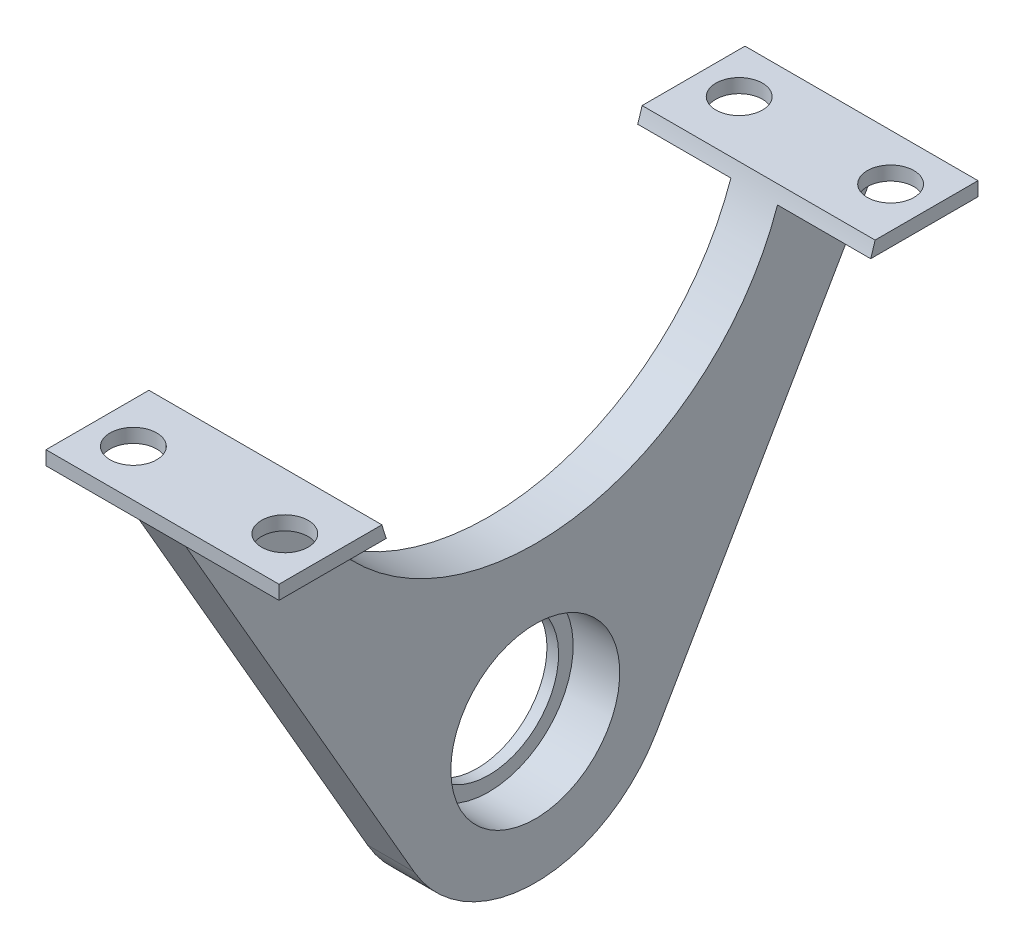
ISO-10303-21;
HEADER;
FILE_DESCRIPTION(('STEP AP214'),'2;1');
FILE_NAME('part.step','',(''),(''),'','','');
FILE_SCHEMA(('AUTOMOTIVE_DESIGN { 1 0 10303 214 1 1 1 1 }'));
ENDSEC;
DATA;
#1=APPLICATION_CONTEXT('core data for automotive mechanical design processes');
#2=APPLICATION_PROTOCOL_DEFINITION('international standard','automotive_design',2000,#1);
#3=PRODUCT_CONTEXT('',#1,'mechanical');
#4=PRODUCT('Part','Part','',(#3));
#5=PRODUCT_RELATED_PRODUCT_CATEGORY('part','',(#4));
#6=PRODUCT_DEFINITION_FORMATION('','',#4);
#7=PRODUCT_DEFINITION_CONTEXT('part definition',#1,'design');
#8=PRODUCT_DEFINITION('design','',#6,#7);
#9=PRODUCT_DEFINITION_SHAPE('','',#8);
#10=(LENGTH_UNIT() NAMED_UNIT(*) SI_UNIT(.MILLI.,.METRE.));
#11=(NAMED_UNIT(*) PLANE_ANGLE_UNIT() SI_UNIT($,.RADIAN.));
#12=(NAMED_UNIT(*) SI_UNIT($,.STERADIAN.) SOLID_ANGLE_UNIT());
#13=UNCERTAINTY_MEASURE_WITH_UNIT(LENGTH_MEASURE(1.E-05),#10,'distance_accuracy_value','');
#14=(GEOMETRIC_REPRESENTATION_CONTEXT(3) GLOBAL_UNCERTAINTY_ASSIGNED_CONTEXT((#13)) GLOBAL_UNIT_ASSIGNED_CONTEXT((#10,
#11,#12)) REPRESENTATION_CONTEXT('',''));
#15=CARTESIAN_POINT('',(0.,0.,0.));
#16=DIRECTION('',(0.,0.,1.));
#17=DIRECTION('',(1.,0.,0.));
#18=AXIS2_PLACEMENT_3D('',#15,#16,#17);
#19=CARTESIAN_POINT('',(0.,0.,60.));
#20=DIRECTION('',(-1.,0.,0.));
#21=DIRECTION('',(0.,0.,1.));
#22=AXIS2_PLACEMENT_3D('',#19,#20,#21);
#23=PLANE('',#22);
#24=CARTESIAN_POINT('',(0.,12.,30.));
#25=DIRECTION('',(-1.,0.,0.));
#26=DIRECTION('',(0.,0.,1.));
#27=AXIS2_PLACEMENT_3D('',#24,#25,#26);
#28=CIRCLE('',#27,7.25);
#29=CARTESIAN_POINT('',(0.,12.,37.25));
#30=VERTEX_POINT('',#29);
#31=EDGE_CURVE('E377',#30,#30,#28,.F.);
#32=ORIENTED_EDGE('',*,*,#31,.F.);
#33=EDGE_LOOP('',(#32));
#34=FACE_BOUND('',#33,.T.);
#35=DIRECTION('',(0.,0.866270394738433,0.499575422934035));
#36=VECTOR('',#35,1.);
#37=CARTESIAN_POINT('',(0.,9.98302412798879,42.6893040469326));
#38=LINE('',#37,#36);
#39=CARTESIAN_POINT('',(0.,6.00509492479158,40.3952447368612));
#40=VERTEX_POINT('',#39);
#41=CARTESIAN_POINT('',(0.,40.,60.));
#42=VERTEX_POINT('',#41);
#43=EDGE_CURVE('E282',#40,#42,#38,.T.);
#44=ORIENTED_EDGE('',*,*,#43,.F.);
#45=CARTESIAN_POINT('',(0.,12.,30.));
#46=DIRECTION('',(-1.,0.,0.));
#47=DIRECTION('',(0.,0.,1.));
#48=AXIS2_PLACEMENT_3D('',#45,#46,#47);
#49=CIRCLE('',#48,12.);
#50=CARTESIAN_POINT('',(0.,6.00509492479158,19.6047552631388));
#51=VERTEX_POINT('',#50);
#52=EDGE_CURVE('E374',#40,#51,#49,.F.);
#53=ORIENTED_EDGE('',*,*,#52,.T.);
#54=DIRECTION('',(0.,-0.866270394738433,0.499575422934035));
#55=VECTOR('',#54,1.);
#56=CARTESIAN_POINT('',(0.,-15.9830198016124,32.2852321450506));
#57=LINE('',#56,#55);
#58=CARTESIAN_POINT('',(0.,40.,0.));
#59=VERTEX_POINT('',#58);
#60=EDGE_CURVE('E380',#59,#51,#57,.T.);
#61=ORIENTED_EDGE('',*,*,#60,.F.);
#62=DIRECTION('',(0.,0.,-1.));
#63=VECTOR('',#62,1.);
#64=CARTESIAN_POINT('',(0.,40.,60.));
#65=LINE('',#64,#63);
#66=CARTESIAN_POINT('',(0.,40.,9.21154166370193));
#67=VERTEX_POINT('',#66);
#68=EDGE_CURVE('E323',#67,#59,#65,.T.);
#69=ORIENTED_EDGE('',*,*,#68,.F.);
#70=CARTESIAN_POINT('',(0.,47.2,30.));
#71=DIRECTION('',(-1.,0.,0.));
#72=DIRECTION('',(0.,0.,1.));
#73=AXIS2_PLACEMENT_3D('',#70,#71,#72);
#74=CIRCLE('',#73,22.);
#75=CARTESIAN_POINT('',(0.,40.,50.7884583362981));
#76=VERTEX_POINT('',#75);
#77=EDGE_CURVE('E363',#76,#67,#74,.F.);
#78=ORIENTED_EDGE('',*,*,#77,.F.);
#79=EDGE_CURVE('E324',#42,#76,#65,.T.);
#80=ORIENTED_EDGE('',*,*,#79,.F.);
#81=EDGE_LOOP('',(#44,#53,#61,#69,#78,#80));
#82=FACE_BOUND('',#81,.T.);
#83=ADVANCED_FACE('F167',(#34,#82),#23,.F.);
#84=CARTESIAN_POINT('',(-4.,40.,60.));
#85=DIRECTION('',(1.,0.,0.));
#86=DIRECTION('',(0.,1.,0.));
#87=AXIS2_PLACEMENT_3D('',#84,#85,#86);
#88=PLANE('',#87);
#89=CARTESIAN_POINT('',(-4.,12.,30.));
#90=DIRECTION('',(1.,0.,0.));
#91=DIRECTION('',(0.,1.,0.));
#92=AXIS2_PLACEMENT_3D('',#89,#90,#91);
#93=CIRCLE('',#92,7.99999999999999);
#94=CARTESIAN_POINT('',(-4.,20.,30.));
#95=VERTEX_POINT('',#94);
#96=EDGE_CURVE('E12',#95,#95,#93,.F.);
#97=ORIENTED_EDGE('',*,*,#96,.F.);
#98=EDGE_LOOP('',(#97));
#99=FACE_BOUND('',#98,.T.);
#100=CARTESIAN_POINT('',(-4.,12.,30.));
#101=DIRECTION('',(1.,0.,0.));
#102=DIRECTION('',(0.,1.,0.));
#103=AXIS2_PLACEMENT_3D('',#100,#101,#102);
#104=CIRCLE('',#103,12.);
#105=CARTESIAN_POINT('',(-4.,6.00509492479158,19.6047552631388));
#106=VERTEX_POINT('',#105);
#107=CARTESIAN_POINT('',(-4.,6.00509492479158,40.3952447368612));
#108=VERTEX_POINT('',#107);
#109=EDGE_CURVE('E290',#106,#108,#104,.F.);
#110=ORIENTED_EDGE('',*,*,#109,.T.);
#111=DIRECTION('',(0.,-0.866270394738433,-0.499575422934035));
#112=VECTOR('',#111,1.);
#113=CARTESIAN_POINT('',(-4.,40.,60.));
#114=LINE('',#113,#112);
#115=CARTESIAN_POINT('',(-4.,40.,60.));
#116=VERTEX_POINT('',#115);
#117=EDGE_CURVE('E279',#116,#108,#114,.T.);
#118=ORIENTED_EDGE('',*,*,#117,.F.);
#119=DIRECTION('',(0.,0.,-1.));
#120=VECTOR('',#119,1.);
#121=CARTESIAN_POINT('',(-4.,40.,60.));
#122=LINE('',#121,#120);
#123=CARTESIAN_POINT('',(-4.,40.,50.7884583362981));
#124=VERTEX_POINT('',#123);
#125=EDGE_CURVE('E289',#116,#124,#122,.T.);
#126=ORIENTED_EDGE('',*,*,#125,.T.);
#127=CARTESIAN_POINT('',(-4.,47.2,30.));
#128=DIRECTION('',(1.,0.,0.));
#129=DIRECTION('',(0.,1.,0.));
#130=AXIS2_PLACEMENT_3D('',#127,#128,#129);
#131=CIRCLE('',#130,22.);
#132=CARTESIAN_POINT('',(-4.,40.,9.21154166370194));
#133=VERTEX_POINT('',#132);
#134=EDGE_CURVE('E284',#133,#124,#131,.F.);
#135=ORIENTED_EDGE('',*,*,#134,.F.);
#136=CARTESIAN_POINT('',(-4.,40.,0.));
#137=VERTEX_POINT('',#136);
#138=EDGE_CURVE('E298',#133,#137,#122,.T.);
#139=ORIENTED_EDGE('',*,*,#138,.T.);
#140=DIRECTION('',(0.,0.866270394738433,-0.499575422934035));
#141=VECTOR('',#140,1.);
#142=CARTESIAN_POINT('',(-4.,14.0339560703988,14.9745361919832));
#143=LINE('',#142,#141);
#144=EDGE_CURVE('E215',#106,#137,#143,.T.);
#145=ORIENTED_EDGE('',*,*,#144,.F.);
#146=EDGE_LOOP('',(#110,#118,#126,#135,#139,#145));
#147=FACE_BOUND('',#146,.T.);
#148=ADVANCED_FACE('F287',(#99,#147),#88,.F.);
#149=CARTESIAN_POINT('',(0.,0.,60.));
#150=DIRECTION('',(0.,0.,1.));
#151=DIRECTION('',(1.,0.,0.));
#152=AXIS2_PLACEMENT_3D('',#149,#150,#151);
#153=PLANE('',#152);
#154=DIRECTION('',(1.,0.,0.));
#155=VECTOR('',#154,1.);
#156=CARTESIAN_POINT('',(-12.,40.,60.));
#157=LINE('',#156,#155);
#158=CARTESIAN_POINT('',(-12.,40.,60.));
#159=VERTEX_POINT('',#158);
#160=EDGE_CURVE('E294',#159,#116,#157,.T.);
#161=ORIENTED_EDGE('',*,*,#160,.T.);
#162=DIRECTION('',(1.,0.,0.));
#163=VECTOR('',#162,1.);
#164=CARTESIAN_POINT('',(0.,40.,60.));
#165=LINE('',#164,#163);
#166=EDGE_CURVE('E174',#116,#42,#165,.T.);
#167=ORIENTED_EDGE('',*,*,#166,.T.);
#168=DIRECTION('',(1.,0.,0.));
#169=VECTOR('',#168,1.);
#170=CARTESIAN_POINT('',(0.,40.,60.));
#171=LINE('',#170,#169);
#172=CARTESIAN_POINT('',(8.,40.,60.));
#173=VERTEX_POINT('',#172);
#174=EDGE_CURVE('E222',#42,#173,#171,.T.);
#175=ORIENTED_EDGE('',*,*,#174,.T.);
#176=DIRECTION('',(0.,1.,0.));
#177=VECTOR('',#176,1.);
#178=CARTESIAN_POINT('',(8.,40.,60.));
#179=LINE('',#178,#177);
#180=CARTESIAN_POINT('',(8.,41.2,60.));
#181=VERTEX_POINT('',#180);
#182=EDGE_CURVE('E343',#173,#181,#179,.T.);
#183=ORIENTED_EDGE('',*,*,#182,.T.);
#184=DIRECTION('',(-1.,0.,0.));
#185=VECTOR('',#184,1.);
#186=CARTESIAN_POINT('',(8.,41.2,60.));
#187=LINE('',#186,#185);
#188=CARTESIAN_POINT('',(-12.,41.2,60.));
#189=VERTEX_POINT('',#188);
#190=EDGE_CURVE('E358',#181,#189,#187,.T.);
#191=ORIENTED_EDGE('',*,*,#190,.T.);
#192=DIRECTION('',(0.,-1.,0.));
#193=VECTOR('',#192,1.);
#194=CARTESIAN_POINT('',(-12.,41.2,60.));
#195=LINE('',#194,#193);
#196=EDGE_CURVE('E190',#189,#159,#195,.T.);
#197=ORIENTED_EDGE('',*,*,#196,.T.);
#198=EDGE_LOOP('',(#161,#167,#175,#183,#191,#197));
#199=FACE_BOUND('',#198,.T.);
#200=ADVANCED_FACE('F295',(#199),#153,.T.);
#201=CARTESIAN_POINT('',(0.,40.,60.));
#202=DIRECTION('',(0.,1.,0.));
#203=DIRECTION('',(-1.,0.,0.));
#204=AXIS2_PLACEMENT_3D('',#201,#202,#203);
#205=PLANE('',#204);
#206=CARTESIAN_POINT('',(4.5,40.,4.));
#207=DIRECTION('',(0.,-1.,0.));
#208=DIRECTION('',(-1.,0.,0.));
#209=AXIS2_PLACEMENT_3D('',#206,#207,#208);
#210=CIRCLE('',#209,2.);
#211=CARTESIAN_POINT('',(6.5,40.,4.));
#212=VERTEX_POINT('',#211);
#213=EDGE_CURVE('E414',#212,#212,#210,.T.);
#214=ORIENTED_EDGE('',*,*,#213,.F.);
#215=EDGE_LOOP('',(#214));
#216=FACE_BOUND('',#215,.T.);
#217=DIRECTION('',(-1.,0.,0.));
#218=VECTOR('',#217,1.);
#219=CARTESIAN_POINT('',(40.,40.,9.21154166370193));
#220=LINE('',#219,#218);
#221=CARTESIAN_POINT('',(8.,40.,9.21154166370194));
#222=VERTEX_POINT('',#221);
#223=EDGE_CURVE('E365',#67,#222,#220,.F.);
#224=ORIENTED_EDGE('',*,*,#223,.F.);
#225=ORIENTED_EDGE('',*,*,#68,.T.);
#226=DIRECTION('',(1.,0.,0.));
#227=VECTOR('',#226,1.);
#228=CARTESIAN_POINT('',(0.,40.,0.));
#229=LINE('',#228,#227);
#230=CARTESIAN_POINT('',(8.,40.,0.));
#231=VERTEX_POINT('',#230);
#232=EDGE_CURVE('E353',#59,#231,#229,.T.);
#233=ORIENTED_EDGE('',*,*,#232,.T.);
#234=DIRECTION('',(0.,0.,-1.));
#235=VECTOR('',#234,1.);
#236=CARTESIAN_POINT('',(8.,40.,60.));
#237=LINE('',#236,#235);
#238=EDGE_CURVE('E319',#222,#231,#237,.T.);
#239=ORIENTED_EDGE('',*,*,#238,.F.);
#240=EDGE_LOOP('',(#224,#225,#233,#239));
#241=FACE_BOUND('',#240,.T.);
#242=ADVANCED_FACE('F436',(#216,#241),#205,.F.);
#243=CARTESIAN_POINT('',(4.5,40.,56.));
#244=DIRECTION('',(0.,-1.,0.));
#245=DIRECTION('',(1.,0.,0.));
#246=AXIS2_PLACEMENT_3D('',#243,#244,#245);
#247=CIRCLE('',#246,2.);
#248=CARTESIAN_POINT('',(6.5,40.,56.));
#249=VERTEX_POINT('',#248);
#250=EDGE_CURVE('E425',#249,#249,#247,.T.);
#251=ORIENTED_EDGE('',*,*,#250,.F.);
#252=EDGE_LOOP('',(#251));
#253=FACE_BOUND('',#252,.T.);
#254=DIRECTION('',(-1.,0.,0.));
#255=VECTOR('',#254,1.);
#256=CARTESIAN_POINT('',(40.,40.,50.7884583362981));
#257=LINE('',#256,#255);
#258=CARTESIAN_POINT('',(8.,40.,50.7884583362981));
#259=VERTEX_POINT('',#258);
#260=EDGE_CURVE('E361',#259,#76,#257,.T.);
#261=ORIENTED_EDGE('',*,*,#260,.F.);
#262=EDGE_CURVE('E320',#173,#259,#237,.T.);
#263=ORIENTED_EDGE('',*,*,#262,.F.);
#264=ORIENTED_EDGE('',*,*,#174,.F.);
#265=ORIENTED_EDGE('',*,*,#79,.T.);
#266=EDGE_LOOP('',(#261,#263,#264,#265));
#267=FACE_BOUND('',#266,.T.);
#268=ADVANCED_FACE('F432',(#253,#267),#205,.F.);
#269=CARTESIAN_POINT('',(8.,40.,60.));
#270=DIRECTION('',(-1.,0.,0.));
#271=DIRECTION('',(0.,0.,1.));
#272=AXIS2_PLACEMENT_3D('',#269,#270,#271);
#273=PLANE('',#272);
#274=CARTESIAN_POINT('',(8.,47.2,30.));
#275=DIRECTION('',(-1.,0.,0.));
#276=DIRECTION('',(0.,0.,1.));
#277=AXIS2_PLACEMENT_3D('',#274,#275,#276);
#278=CIRCLE('',#277,22.);
#279=CARTESIAN_POINT('',(8.,41.2,51.1660104885167));
#280=VERTEX_POINT('',#279);
#281=EDGE_CURVE('E355',#280,#259,#278,.F.);
#282=ORIENTED_EDGE('',*,*,#281,.F.);
#283=DIRECTION('',(0.,0.,-1.));
#284=VECTOR('',#283,1.);
#285=CARTESIAN_POINT('',(8.,41.2,60.));
#286=LINE('',#285,#284);
#287=EDGE_CURVE('E316',#181,#280,#286,.T.);
#288=ORIENTED_EDGE('',*,*,#287,.F.);
#289=ORIENTED_EDGE('',*,*,#182,.F.);
#290=ORIENTED_EDGE('',*,*,#262,.T.);
#291=EDGE_LOOP('',(#282,#288,#289,#290));
#292=FACE_BOUND('',#291,.T.);
#293=ADVANCED_FACE('F435',(#292),#273,.F.);
#294=CARTESIAN_POINT('',(8.,41.2,60.));
#295=DIRECTION('',(0.,-1.,0.));
#296=DIRECTION('',(0.,0.,-1.));
#297=AXIS2_PLACEMENT_3D('',#294,#295,#296);
#298=PLANE('',#297);
#299=CARTESIAN_POINT('',(-8.50000000000001,41.2,56.));
#300=DIRECTION('',(0.,-1.,0.));
#301=DIRECTION('',(0.,0.,-1.));
#302=AXIS2_PLACEMENT_3D('',#299,#300,#301);
#303=CIRCLE('',#302,2.);
#304=CARTESIAN_POINT('',(-6.5,41.2,56.));
#305=VERTEX_POINT('',#304);
#306=EDGE_CURVE('E411',#305,#305,#303,.F.);
#307=ORIENTED_EDGE('',*,*,#306,.F.);
#308=EDGE_LOOP('',(#307));
#309=FACE_BOUND('',#308,.T.);
#310=CARTESIAN_POINT('',(4.5,41.2,56.));
#311=DIRECTION('',(0.,-1.,0.));
#312=DIRECTION('',(0.,0.,-1.));
#313=AXIS2_PLACEMENT_3D('',#310,#311,#312);
#314=CIRCLE('',#313,2.);
#315=CARTESIAN_POINT('',(6.5,41.2,56.));
#316=VERTEX_POINT('',#315);
#317=EDGE_CURVE('E418',#316,#316,#314,.F.);
#318=ORIENTED_EDGE('',*,*,#317,.F.);
#319=EDGE_LOOP('',(#318));
#320=FACE_BOUND('',#319,.T.);
#321=DIRECTION('',(-1.,0.,0.));
#322=VECTOR('',#321,1.);
#323=CARTESIAN_POINT('',(40.,41.2,51.1660104885167));
#324=LINE('',#323,#322);
#325=CARTESIAN_POINT('',(-12.,41.2,51.1660104885167));
#326=VERTEX_POINT('',#325);
#327=EDGE_CURVE('E384',#280,#326,#324,.T.);
#328=ORIENTED_EDGE('',*,*,#327,.T.);
#329=DIRECTION('',(0.,0.,-1.));
#330=VECTOR('',#329,1.);
#331=CARTESIAN_POINT('',(-12.,41.2,60.));
#332=LINE('',#331,#330);
#333=EDGE_CURVE('E312',#189,#326,#332,.T.);
#334=ORIENTED_EDGE('',*,*,#333,.F.);
#335=ORIENTED_EDGE('',*,*,#190,.F.);
#336=ORIENTED_EDGE('',*,*,#287,.T.);
#337=EDGE_LOOP('',(#328,#334,#335,#336));
#338=FACE_BOUND('',#337,.T.);
#339=ADVANCED_FACE('F446',(#309,#320,#338),#298,.F.);
#340=CARTESIAN_POINT('',(4.5,41.2,4.));
#341=DIRECTION('',(0.,-1.,0.));
#342=DIRECTION('',(0.,0.,-1.));
#343=AXIS2_PLACEMENT_3D('',#340,#341,#342);
#344=CIRCLE('',#343,2.);
#345=CARTESIAN_POINT('',(6.5,41.2,4.));
#346=VERTEX_POINT('',#345);
#347=EDGE_CURVE('E410',#346,#346,#344,.F.);
#348=ORIENTED_EDGE('',*,*,#347,.F.);
#349=EDGE_LOOP('',(#348));
#350=FACE_BOUND('',#349,.T.);
#351=CARTESIAN_POINT('',(-8.50000000000001,41.2,4.));
#352=DIRECTION('',(0.,-1.,0.));
#353=DIRECTION('',(0.,0.,-1.));
#354=AXIS2_PLACEMENT_3D('',#351,#352,#353);
#355=CIRCLE('',#354,2.);
#356=CARTESIAN_POINT('',(-6.50000000000001,41.2,4.));
#357=VERTEX_POINT('',#356);
#358=EDGE_CURVE('E402',#357,#357,#355,.F.);
#359=ORIENTED_EDGE('',*,*,#358,.F.);
#360=EDGE_LOOP('',(#359));
#361=FACE_BOUND('',#360,.T.);
#362=DIRECTION('',(-1.,0.,0.));
#363=VECTOR('',#362,1.);
#364=CARTESIAN_POINT('',(40.,41.2,8.83398951148327));
#365=LINE('',#364,#363);
#366=CARTESIAN_POINT('',(8.,41.2,8.83398951148327));
#367=VERTEX_POINT('',#366);
#368=CARTESIAN_POINT('',(-12.,41.2,8.83398951148327));
#369=VERTEX_POINT('',#368);
#370=EDGE_CURVE('E383',#367,#369,#365,.T.);
#371=ORIENTED_EDGE('',*,*,#370,.F.);
#372=CARTESIAN_POINT('',(8.,41.2,0.));
#373=VERTEX_POINT('',#372);
#374=EDGE_CURVE('E315',#367,#373,#286,.T.);
#375=ORIENTED_EDGE('',*,*,#374,.T.);
#376=DIRECTION('',(-1.,0.,0.));
#377=VECTOR('',#376,1.);
#378=CARTESIAN_POINT('',(8.,41.2,0.));
#379=LINE('',#378,#377);
#380=CARTESIAN_POINT('',(-12.,41.2,0.));
#381=VERTEX_POINT('',#380);
#382=EDGE_CURVE('E345',#373,#381,#379,.T.);
#383=ORIENTED_EDGE('',*,*,#382,.T.);
#384=EDGE_CURVE('E311',#369,#381,#332,.T.);
#385=ORIENTED_EDGE('',*,*,#384,.F.);
#386=EDGE_LOOP('',(#371,#375,#383,#385));
#387=FACE_BOUND('',#386,.T.);
#388=ADVANCED_FACE('F467',(#350,#361,#387),#298,.F.);
#389=CARTESIAN_POINT('',(-12.,41.2,60.));
#390=DIRECTION('',(1.,0.,0.));
#391=DIRECTION('',(0.,0.,-1.));
#392=AXIS2_PLACEMENT_3D('',#389,#390,#391);
#393=PLANE('',#392);
#394=CARTESIAN_POINT('',(-12.,47.2,30.));
#395=DIRECTION('',(1.,0.,0.));
#396=DIRECTION('',(0.,0.,-1.));
#397=AXIS2_PLACEMENT_3D('',#394,#395,#396);
#398=CIRCLE('',#397,22.);
#399=CARTESIAN_POINT('',(-12.,40.,9.21154166370196));
#400=VERTEX_POINT('',#399);
#401=EDGE_CURVE('E369',#369,#400,#398,.F.);
#402=ORIENTED_EDGE('',*,*,#401,.F.);
#403=ORIENTED_EDGE('',*,*,#384,.T.);
#404=DIRECTION('',(0.,-1.,0.));
#405=VECTOR('',#404,1.);
#406=CARTESIAN_POINT('',(-12.,41.2,0.));
#407=LINE('',#406,#405);
#408=CARTESIAN_POINT('',(-12.,40.,0.));
#409=VERTEX_POINT('',#408);
#410=EDGE_CURVE('E342',#381,#409,#407,.T.);
#411=ORIENTED_EDGE('',*,*,#410,.T.);
#412=DIRECTION('',(0.,0.,-1.));
#413=VECTOR('',#412,1.);
#414=CARTESIAN_POINT('',(-12.,40.,60.));
#415=LINE('',#414,#413);
#416=EDGE_CURVE('E303',#400,#409,#415,.T.);
#417=ORIENTED_EDGE('',*,*,#416,.F.);
#418=EDGE_LOOP('',(#402,#403,#411,#417));
#419=FACE_BOUND('',#418,.T.);
#420=ADVANCED_FACE('F453',(#419),#393,.F.);
#421=CARTESIAN_POINT('',(-12.,40.,60.));
#422=DIRECTION('',(0.,1.,0.));
#423=DIRECTION('',(-1.,0.,0.));
#424=AXIS2_PLACEMENT_3D('',#421,#422,#423);
#425=PLANE('',#424);
#426=CARTESIAN_POINT('',(-8.5,40.,4.));
#427=DIRECTION('',(0.,-1.,0.));
#428=DIRECTION('',(1.,0.,0.));
#429=AXIS2_PLACEMENT_3D('',#426,#427,#428);
#430=CIRCLE('',#429,2.);
#431=CARTESIAN_POINT('',(-6.5,40.,4.));
#432=VERTEX_POINT('',#431);
#433=EDGE_CURVE('E407',#432,#432,#430,.T.);
#434=ORIENTED_EDGE('',*,*,#433,.F.);
#435=EDGE_LOOP('',(#434));
#436=FACE_BOUND('',#435,.T.);
#437=DIRECTION('',(-1.,0.,0.));
#438=VECTOR('',#437,1.);
#439=CARTESIAN_POINT('',(40.,40.,9.21154166370196));
#440=LINE('',#439,#438);
#441=EDGE_CURVE('E181',#400,#133,#440,.F.);
#442=ORIENTED_EDGE('',*,*,#441,.F.);
#443=ORIENTED_EDGE('',*,*,#416,.T.);
#444=DIRECTION('',(1.,0.,0.));
#445=VECTOR('',#444,1.);
#446=CARTESIAN_POINT('',(-12.,40.,0.));
#447=LINE('',#446,#445);
#448=EDGE_CURVE('E308',#409,#137,#447,.T.);
#449=ORIENTED_EDGE('',*,*,#448,.T.);
#450=ORIENTED_EDGE('',*,*,#138,.F.);
#451=EDGE_LOOP('',(#442,#443,#449,#450));
#452=FACE_BOUND('',#451,.T.);
#453=ADVANCED_FACE('F336',(#436,#452),#425,.F.);
#454=CARTESIAN_POINT('',(-8.5,40.,56.));
#455=DIRECTION('',(0.,-1.,0.));
#456=DIRECTION('',(-1.,0.,0.));
#457=AXIS2_PLACEMENT_3D('',#454,#455,#456);
#458=CIRCLE('',#457,2.);
#459=CARTESIAN_POINT('',(-6.5,40.,56.));
#460=VERTEX_POINT('',#459);
#461=EDGE_CURVE('E415',#460,#460,#458,.T.);
#462=ORIENTED_EDGE('',*,*,#461,.F.);
#463=EDGE_LOOP('',(#462));
#464=FACE_BOUND('',#463,.T.);
#465=DIRECTION('',(-1.,0.,0.));
#466=VECTOR('',#465,1.);
#467=CARTESIAN_POINT('',(40.,40.,50.788458336298));
#468=LINE('',#467,#466);
#469=CARTESIAN_POINT('',(-12.,40.,50.788458336298));
#470=VERTEX_POINT('',#469);
#471=EDGE_CURVE('E302',#124,#470,#468,.T.);
#472=ORIENTED_EDGE('',*,*,#471,.F.);
#473=ORIENTED_EDGE('',*,*,#125,.F.);
#474=ORIENTED_EDGE('',*,*,#160,.F.);
#475=EDGE_CURVE('E305',#159,#470,#415,.T.);
#476=ORIENTED_EDGE('',*,*,#475,.T.);
#477=EDGE_LOOP('',(#472,#473,#474,#476));
#478=FACE_BOUND('',#477,.T.);
#479=ADVANCED_FACE('F301',(#464,#478),#425,.F.);
#480=CARTESIAN_POINT('',(0.,0.,0.));
#481=DIRECTION('',(0.,0.,1.));
#482=DIRECTION('',(1.,0.,0.));
#483=AXIS2_PLACEMENT_3D('',#480,#481,#482);
#484=PLANE('',#483);
#485=DIRECTION('',(1.,0.,0.));
#486=VECTOR('',#485,1.);
#487=CARTESIAN_POINT('',(0.,40.,0.));
#488=LINE('',#487,#486);
#489=EDGE_CURVE('E327',#137,#59,#488,.T.);
#490=ORIENTED_EDGE('',*,*,#489,.F.);
#491=ORIENTED_EDGE('',*,*,#448,.F.);
#492=ORIENTED_EDGE('',*,*,#410,.F.);
#493=ORIENTED_EDGE('',*,*,#382,.F.);
#494=DIRECTION('',(0.,1.,0.));
#495=VECTOR('',#494,1.);
#496=CARTESIAN_POINT('',(8.,40.,0.));
#497=LINE('',#496,#495);
#498=EDGE_CURVE('E348',#231,#373,#497,.T.);
#499=ORIENTED_EDGE('',*,*,#498,.F.);
#500=ORIENTED_EDGE('',*,*,#232,.F.);
#501=EDGE_LOOP('',(#490,#491,#492,#493,#499,#500));
#502=FACE_BOUND('',#501,.T.);
#503=ADVANCED_FACE('F461',(#502),#484,.F.);
#504=EDGE_CURVE('E367',#222,#367,#278,.F.);
#505=ORIENTED_EDGE('',*,*,#504,.F.);
#506=ORIENTED_EDGE('',*,*,#238,.T.);
#507=ORIENTED_EDGE('',*,*,#498,.T.);
#508=ORIENTED_EDGE('',*,*,#374,.F.);
#509=EDGE_LOOP('',(#505,#506,#507,#508));
#510=FACE_BOUND('',#509,.T.);
#511=ADVANCED_FACE('F451',(#510),#273,.F.);
#512=EDGE_CURVE('E370',#470,#326,#398,.F.);
#513=ORIENTED_EDGE('',*,*,#512,.F.);
#514=ORIENTED_EDGE('',*,*,#475,.F.);
#515=ORIENTED_EDGE('',*,*,#196,.F.);
#516=ORIENTED_EDGE('',*,*,#333,.T.);
#517=EDGE_LOOP('',(#513,#514,#515,#516));
#518=FACE_BOUND('',#517,.T.);
#519=ADVANCED_FACE('F448',(#518),#393,.F.);
#520=CARTESIAN_POINT('',(40.,12.,30.));
#521=DIRECTION('',(-1.,0.,0.));
#522=DIRECTION('',(0.,0.,1.));
#523=AXIS2_PLACEMENT_3D('',#520,#521,#522);
#524=CYLINDRICAL_SURFACE('',#523,12.);
#525=ORIENTED_EDGE('',*,*,#52,.F.);
#526=DIRECTION('',(1.,0.,0.));
#527=VECTOR('',#526,1.);
#528=CARTESIAN_POINT('',(-40.,6.00509492479158,40.3952447368612));
#529=LINE('',#528,#527);
#530=EDGE_CURVE('E291',#108,#40,#529,.T.);
#531=ORIENTED_EDGE('',*,*,#530,.F.);
#532=ORIENTED_EDGE('',*,*,#109,.F.);
#533=DIRECTION('',(-1.,0.,0.));
#534=VECTOR('',#533,1.);
#535=CARTESIAN_POINT('',(40.,6.00509492479158,19.6047552631388));
#536=LINE('',#535,#534);
#537=EDGE_CURVE('E387',#51,#106,#536,.T.);
#538=ORIENTED_EDGE('',*,*,#537,.F.);
#539=EDGE_LOOP('',(#525,#531,#532,#538));
#540=FACE_BOUND('',#539,.T.);
#541=ADVANCED_FACE('F450',(#540),#524,.T.);
#542=CARTESIAN_POINT('',(40.,9.9830241279888,17.3106959530674));
#543=DIRECTION('',(0.,-0.499575422934035,-0.866270394738433));
#544=DIRECTION('',(0.,0.866270394738433,-0.499575422934035));
#545=AXIS2_PLACEMENT_3D('',#542,#543,#544);
#546=PLANE('',#545);
#547=ORIENTED_EDGE('',*,*,#60,.T.);
#548=ORIENTED_EDGE('',*,*,#537,.T.);
#549=ORIENTED_EDGE('',*,*,#144,.T.);
#550=ORIENTED_EDGE('',*,*,#489,.T.);
#551=EDGE_LOOP('',(#547,#548,#549,#550));
#552=FACE_BOUND('',#551,.T.);
#553=ADVANCED_FACE('F458',(#552),#546,.T.);
#554=CARTESIAN_POINT('',(40.,12.,30.));
#555=DIRECTION('',(-1.,0.,0.));
#556=DIRECTION('',(0.,0.,1.));
#557=AXIS2_PLACEMENT_3D('',#554,#555,#556);
#558=CYLINDRICAL_SURFACE('',#557,7.25);
#559=CARTESIAN_POINT('',(-4.,12.,30.));
#560=DIRECTION('',(-1.,0.,0.));
#561=DIRECTION('',(0.,-1.,0.));
#562=AXIS2_PLACEMENT_3D('',#559,#560,#561);
#563=CIRCLE('',#562,7.25);
#564=CARTESIAN_POINT('',(-4.,4.75,30.));
#565=VERTEX_POINT('',#564);
#566=EDGE_CURVE('E392',#565,#565,#563,.T.);
#567=ORIENTED_EDGE('',*,*,#566,.T.);
#568=EDGE_LOOP('',(#567));
#569=FACE_BOUND('',#568,.T.);
#570=ORIENTED_EDGE('',*,*,#31,.T.);
#571=EDGE_LOOP('',(#570));
#572=FACE_BOUND('',#571,.T.);
#573=ADVANCED_FACE('F559',(#569,#572),#558,.F.);
#574=CARTESIAN_POINT('',(40.,47.2,30.));
#575=DIRECTION('',(-1.,0.,0.));
#576=DIRECTION('',(0.,0.,1.));
#577=AXIS2_PLACEMENT_3D('',#574,#575,#576);
#578=CYLINDRICAL_SURFACE('',#577,22.);
#579=ORIENTED_EDGE('',*,*,#281,.T.);
#580=ORIENTED_EDGE('',*,*,#260,.T.);
#581=ORIENTED_EDGE('',*,*,#77,.T.);
#582=ORIENTED_EDGE('',*,*,#223,.T.);
#583=ORIENTED_EDGE('',*,*,#504,.T.);
#584=ORIENTED_EDGE('',*,*,#370,.T.);
#585=ORIENTED_EDGE('',*,*,#401,.T.);
#586=ORIENTED_EDGE('',*,*,#441,.T.);
#587=ORIENTED_EDGE('',*,*,#134,.T.);
#588=ORIENTED_EDGE('',*,*,#471,.T.);
#589=ORIENTED_EDGE('',*,*,#512,.T.);
#590=ORIENTED_EDGE('',*,*,#327,.F.);
#591=EDGE_LOOP('',(#579,#580,#581,#582,#583,#584,#585,#586,#587,#588,#589,#590));
#592=FACE_BOUND('',#591,.T.);
#593=ADVANCED_FACE('F330',(#592),#578,.F.);
#594=CARTESIAN_POINT('',(-40.,-15.9830198016124,27.7147678549494));
#595=DIRECTION('',(0.,-0.499575422934035,0.866270394738433));
#596=DIRECTION('',(0.,-0.866270394738433,-0.499575422934035));
#597=AXIS2_PLACEMENT_3D('',#594,#595,#596);
#598=PLANE('',#597);
#599=ORIENTED_EDGE('',*,*,#43,.T.);
#600=ORIENTED_EDGE('',*,*,#166,.F.);
#601=ORIENTED_EDGE('',*,*,#117,.T.);
#602=ORIENTED_EDGE('',*,*,#530,.T.);
#603=EDGE_LOOP('',(#599,#600,#601,#602));
#604=FACE_BOUND('',#603,.T.);
#605=ADVANCED_FACE('F277',(#604),#598,.T.);
#606=CARTESIAN_POINT('',(-4.,12.,30.));
#607=DIRECTION('',(-1.,0.,0.));
#608=DIRECTION('',(0.,-1.,0.));
#609=AXIS2_PLACEMENT_3D('',#606,#607,#608);
#610=PLANE('',#609);
#611=CARTESIAN_POINT('',(-4.,12.,30.));
#612=DIRECTION('',(-1.,0.,0.));
#613=DIRECTION('',(0.,-1.,0.));
#614=AXIS2_PLACEMENT_3D('',#611,#612,#613);
#615=CIRCLE('',#614,6.00000000000001);
#616=CARTESIAN_POINT('',(-4.,6.,30.));
#617=VERTEX_POINT('',#616);
#618=EDGE_CURVE('E399',#617,#617,#615,.T.);
#619=ORIENTED_EDGE('',*,*,#618,.T.);
#620=EDGE_LOOP('',(#619));
#621=FACE_BOUND('',#620,.T.);
#622=ORIENTED_EDGE('',*,*,#566,.F.);
#623=EDGE_LOOP('',(#622));
#624=FACE_BOUND('',#623,.T.);
#625=ADVANCED_FACE('F547',(#621,#624),#610,.F.);
#626=CARTESIAN_POINT('',(-5.,12.,30.));
#627=DIRECTION('',(-1.,0.,0.));
#628=DIRECTION('',(0.,-1.,0.));
#629=AXIS2_PLACEMENT_3D('',#626,#627,#628);
#630=PLANE('',#629);
#631=CARTESIAN_POINT('',(-5.,12.,30.));
#632=DIRECTION('',(-1.,0.,0.));
#633=DIRECTION('',(0.,-1.,0.));
#634=AXIS2_PLACEMENT_3D('',#631,#632,#633);
#635=CIRCLE('',#634,7.99999999999999);
#636=CARTESIAN_POINT('',(-5.,4.00000000000001,30.));
#637=VERTEX_POINT('',#636);
#638=EDGE_CURVE('E395',#637,#637,#635,.T.);
#639=ORIENTED_EDGE('',*,*,#638,.T.);
#640=EDGE_LOOP('',(#639));
#641=FACE_BOUND('',#640,.T.);
#642=CARTESIAN_POINT('',(-5.,12.,30.));
#643=DIRECTION('',(-1.,0.,0.));
#644=DIRECTION('',(0.,-1.,0.));
#645=AXIS2_PLACEMENT_3D('',#642,#643,#644);
#646=CIRCLE('',#645,6.00000000000001);
#647=CARTESIAN_POINT('',(-5.,6.,30.));
#648=VERTEX_POINT('',#647);
#649=EDGE_CURVE('E398',#648,#648,#646,.T.);
#650=ORIENTED_EDGE('',*,*,#649,.F.);
#651=EDGE_LOOP('',(#650));
#652=FACE_BOUND('',#651,.T.);
#653=ADVANCED_FACE('F544',(#641,#652),#630,.T.);
#654=CARTESIAN_POINT('',(-5.,12.,30.));
#655=DIRECTION('',(1.,0.,0.));
#656=DIRECTION('',(0.,1.,0.));
#657=AXIS2_PLACEMENT_3D('',#654,#655,#656);
#658=CYLINDRICAL_SURFACE('',#657,7.99999999999999);
#659=ORIENTED_EDGE('',*,*,#638,.F.);
#660=EDGE_LOOP('',(#659));
#661=FACE_BOUND('',#660,.T.);
#662=ORIENTED_EDGE('',*,*,#96,.T.);
#663=EDGE_LOOP('',(#662));
#664=FACE_BOUND('',#663,.T.);
#665=ADVANCED_FACE('F542',(#661,#664),#658,.T.);
#666=CARTESIAN_POINT('',(-5.,12.,30.));
#667=DIRECTION('',(1.,0.,0.));
#668=DIRECTION('',(0.,1.,0.));
#669=AXIS2_PLACEMENT_3D('',#666,#667,#668);
#670=CYLINDRICAL_SURFACE('',#669,6.00000000000001);
#671=ORIENTED_EDGE('',*,*,#649,.T.);
#672=EDGE_LOOP('',(#671));
#673=FACE_BOUND('',#672,.T.);
#674=ORIENTED_EDGE('',*,*,#618,.F.);
#675=EDGE_LOOP('',(#674));
#676=FACE_BOUND('',#675,.T.);
#677=ADVANCED_FACE('F537',(#673,#676),#670,.F.);
#678=CARTESIAN_POINT('',(-8.50000000000001,41.201,56.));
#679=DIRECTION('',(0.,-1.,0.));
#680=DIRECTION('',(1.,0.,0.));
#681=AXIS2_PLACEMENT_3D('',#678,#679,#680);
#682=CYLINDRICAL_SURFACE('',#681,2.);
#683=CARTESIAN_POINT('',(-6.5,40.,56.));
#684=CARTESIAN_POINT('',(-6.5,40.0125,56.));
#685=CARTESIAN_POINT('',(-6.5,40.025,56.));
#686=CARTESIAN_POINT('',(-6.5,40.05,56.));
#687=CARTESIAN_POINT('',(-6.5,40.0625,56.));
#688=CARTESIAN_POINT('',(-6.5,40.0875,56.));
#689=CARTESIAN_POINT('',(-6.5,40.1,56.));
#690=CARTESIAN_POINT('',(-6.5,40.125,56.));
#691=CARTESIAN_POINT('',(-6.5,40.1375,56.));
#692=CARTESIAN_POINT('',(-6.5,40.1625,56.));
#693=CARTESIAN_POINT('',(-6.5,40.175,56.));
#694=CARTESIAN_POINT('',(-6.5,40.2,56.));
#695=CARTESIAN_POINT('',(-6.5,40.2125,56.));
#696=CARTESIAN_POINT('',(-6.5,40.2375,56.));
#697=CARTESIAN_POINT('',(-6.5,40.25,56.));
#698=CARTESIAN_POINT('',(-6.5,40.275,56.));
#699=CARTESIAN_POINT('',(-6.5,40.2875,56.));
#700=CARTESIAN_POINT('',(-6.5,40.3125,56.));
#701=CARTESIAN_POINT('',(-6.5,40.325,56.));
#702=CARTESIAN_POINT('',(-6.5,40.35,56.));
#703=CARTESIAN_POINT('',(-6.5,40.3625,56.));
#704=CARTESIAN_POINT('',(-6.5,40.3875,56.));
#705=CARTESIAN_POINT('',(-6.5,40.4,56.));
#706=CARTESIAN_POINT('',(-6.5,40.425,56.));
#707=CARTESIAN_POINT('',(-6.5,40.4375,56.));
#708=CARTESIAN_POINT('',(-6.5,40.4625,56.));
#709=CARTESIAN_POINT('',(-6.5,40.475,56.));
#710=CARTESIAN_POINT('',(-6.5,40.5,56.));
#711=CARTESIAN_POINT('',(-6.5,40.5125,56.));
#712=CARTESIAN_POINT('',(-6.5,40.5375,56.));
#713=CARTESIAN_POINT('',(-6.5,40.55,56.));
#714=CARTESIAN_POINT('',(-6.5,40.575,56.));
#715=CARTESIAN_POINT('',(-6.5,40.5875,56.));
#716=CARTESIAN_POINT('',(-6.5,40.6125,56.));
#717=CARTESIAN_POINT('',(-6.5,40.625,56.));
#718=CARTESIAN_POINT('',(-6.5,40.65,56.));
#719=CARTESIAN_POINT('',(-6.5,40.6625,56.));
#720=CARTESIAN_POINT('',(-6.5,40.6875,56.));
#721=CARTESIAN_POINT('',(-6.5,40.7,56.));
#722=CARTESIAN_POINT('',(-6.5,40.725,56.));
#723=CARTESIAN_POINT('',(-6.5,40.7375,56.));
#724=CARTESIAN_POINT('',(-6.5,40.7625,56.));
#725=CARTESIAN_POINT('',(-6.5,40.775,56.));
#726=CARTESIAN_POINT('',(-6.5,40.8,56.));
#727=CARTESIAN_POINT('',(-6.5,40.8125,56.));
#728=CARTESIAN_POINT('',(-6.5,40.8375,56.));
#729=CARTESIAN_POINT('',(-6.5,40.85,56.));
#730=CARTESIAN_POINT('',(-6.5,40.875,56.));
#731=CARTESIAN_POINT('',(-6.5,40.8875,56.));
#732=CARTESIAN_POINT('',(-6.5,40.9125,56.));
#733=CARTESIAN_POINT('',(-6.5,40.925,56.));
#734=CARTESIAN_POINT('',(-6.5,40.95,56.));
#735=CARTESIAN_POINT('',(-6.5,40.9625,56.));
#736=CARTESIAN_POINT('',(-6.5,40.9875,56.));
#737=CARTESIAN_POINT('',(-6.5,41.,56.));
#738=CARTESIAN_POINT('',(-6.5,41.025,56.));
#739=CARTESIAN_POINT('',(-6.5,41.0375,56.));
#740=CARTESIAN_POINT('',(-6.5,41.0625,56.));
#741=CARTESIAN_POINT('',(-6.5,41.075,56.));
#742=CARTESIAN_POINT('',(-6.5,41.1,56.));
#743=CARTESIAN_POINT('',(-6.5,41.1125,56.));
#744=CARTESIAN_POINT('',(-6.5,41.1375,56.));
#745=CARTESIAN_POINT('',(-6.5,41.15,56.));
#746=CARTESIAN_POINT('',(-6.5,41.175,56.));
#747=CARTESIAN_POINT('',(-6.5,41.1875,56.));
#748=CARTESIAN_POINT('',(-6.5,41.2,56.));
#749=B_SPLINE_CURVE_WITH_KNOTS('',3,(#683,#684,#685,#686,#687,#688,#689,#690,#691,#692,#693,
#694,#695,#696,#697,#698,#699,#700,#701,#702,#703,#704,#705,#706,#707,#708,#709,#710,#711,#712,
#713,#714,#715,#716,#717,#718,#719,#720,#721,#722,#723,#724,#725,#726,#727,#728,#729,#730,#731,
#732,#733,#734,#735,#736,#737,#738,#739,#740,#741,#742,#743,#744,#745,#746,#747,#748),
.UNSPECIFIED.,.F.,.F.,(4,2,2,2,2,2,2,2,2,2,2,2,2,2,2,2,2,2,2,2,2,2,2,2,2,2,2,2,2,2,2,2,4),(0.,
0.0374999999999959,0.0749999999999987,0.112499999999995,0.149999999999997,0.1875,
0.224999999999996,0.262499999999999,0.300000000000002,0.337499999999998,0.375,0.412500000000003,
0.449999999999999,0.487500000000002,0.525000000000005,0.5625,0.600000000000003,
0.637500000000006,0.675000000000002,0.712500000000005,0.750000000000008,0.787500000000003,
0.825000000000006,0.862500000000009,0.900000000000005,0.937500000000008,0.975000000000011,
1.01250000000001,1.05000000000001,1.08750000000001,1.12500000000001,1.16250000000001,
1.20000000000001),.UNSPECIFIED.);
#750=EDGE_CURVE('BSEAM510',#460,#305,#749,.T.);
#751=ORIENTED_EDGE('',*,*,#461,.T.);
#752=ORIENTED_EDGE('',*,*,#306,.T.);
#753=ORIENTED_EDGE('',*,*,#750,.T.);
#754=ORIENTED_EDGE('',*,*,#750,.F.);
#755=EDGE_LOOP('',(#751,#753,#752,#754));
#756=FACE_BOUND('',#755,.T.);
#757=ADVANCED_FACE('F510',(#756),#682,.F.);
#758=CARTESIAN_POINT('',(-8.50000000000001,41.201,4.));
#759=DIRECTION('',(0.,-1.,0.));
#760=DIRECTION('',(1.,0.,0.));
#761=AXIS2_PLACEMENT_3D('',#758,#759,#760);
#762=CYLINDRICAL_SURFACE('',#761,2.);
#763=CARTESIAN_POINT('',(-6.5,40.,4.));
#764=CARTESIAN_POINT('',(-6.5,40.0125,4.));
#765=CARTESIAN_POINT('',(-6.5,40.025,4.));
#766=CARTESIAN_POINT('',(-6.5,40.05,4.));
#767=CARTESIAN_POINT('',(-6.5,40.0625,4.));
#768=CARTESIAN_POINT('',(-6.5,40.0875,4.));
#769=CARTESIAN_POINT('',(-6.50000000000001,40.1,4.));
#770=CARTESIAN_POINT('',(-6.50000000000001,40.125,4.));
#771=CARTESIAN_POINT('',(-6.50000000000001,40.1375,4.));
#772=CARTESIAN_POINT('',(-6.50000000000001,40.1625,4.));
#773=CARTESIAN_POINT('',(-6.50000000000001,40.175,4.));
#774=CARTESIAN_POINT('',(-6.50000000000001,40.2,4.));
#775=CARTESIAN_POINT('',(-6.50000000000001,40.2125,4.));
#776=CARTESIAN_POINT('',(-6.50000000000001,40.2375,4.));
#777=CARTESIAN_POINT('',(-6.50000000000001,40.25,4.));
#778=CARTESIAN_POINT('',(-6.50000000000001,40.275,4.));
#779=CARTESIAN_POINT('',(-6.50000000000001,40.2875,4.));
#780=CARTESIAN_POINT('',(-6.50000000000001,40.3125,4.));
#781=CARTESIAN_POINT('',(-6.50000000000001,40.325,4.));
#782=CARTESIAN_POINT('',(-6.50000000000001,40.35,4.));
#783=CARTESIAN_POINT('',(-6.50000000000001,40.3625,4.));
#784=CARTESIAN_POINT('',(-6.50000000000001,40.3875,4.));
#785=CARTESIAN_POINT('',(-6.50000000000001,40.4,4.));
#786=CARTESIAN_POINT('',(-6.50000000000001,40.425,4.));
#787=CARTESIAN_POINT('',(-6.50000000000001,40.4375,4.));
#788=CARTESIAN_POINT('',(-6.50000000000001,40.4625,4.));
#789=CARTESIAN_POINT('',(-6.50000000000001,40.475,4.));
#790=CARTESIAN_POINT('',(-6.50000000000001,40.5,4.));
#791=CARTESIAN_POINT('',(-6.50000000000001,40.5125,4.));
#792=CARTESIAN_POINT('',(-6.50000000000001,40.5375,4.));
#793=CARTESIAN_POINT('',(-6.50000000000001,40.55,4.));
#794=CARTESIAN_POINT('',(-6.50000000000001,40.575,4.));
#795=CARTESIAN_POINT('',(-6.50000000000001,40.5875,4.));
#796=CARTESIAN_POINT('',(-6.50000000000001,40.6125,4.));
#797=CARTESIAN_POINT('',(-6.50000000000001,40.625,4.));
#798=CARTESIAN_POINT('',(-6.50000000000001,40.65,4.));
#799=CARTESIAN_POINT('',(-6.50000000000001,40.6625,4.));
#800=CARTESIAN_POINT('',(-6.50000000000001,40.6875,4.));
#801=CARTESIAN_POINT('',(-6.50000000000001,40.7,4.));
#802=CARTESIAN_POINT('',(-6.50000000000001,40.725,4.));
#803=CARTESIAN_POINT('',(-6.50000000000001,40.7375,4.));
#804=CARTESIAN_POINT('',(-6.50000000000001,40.7625,4.));
#805=CARTESIAN_POINT('',(-6.50000000000001,40.775,4.));
#806=CARTESIAN_POINT('',(-6.50000000000001,40.8,4.));
#807=CARTESIAN_POINT('',(-6.50000000000001,40.8125,4.));
#808=CARTESIAN_POINT('',(-6.50000000000001,40.8375,4.));
#809=CARTESIAN_POINT('',(-6.50000000000001,40.85,4.));
#810=CARTESIAN_POINT('',(-6.50000000000001,40.875,4.));
#811=CARTESIAN_POINT('',(-6.50000000000001,40.8875,4.));
#812=CARTESIAN_POINT('',(-6.50000000000001,40.9125,4.));
#813=CARTESIAN_POINT('',(-6.50000000000001,40.925,4.));
#814=CARTESIAN_POINT('',(-6.50000000000001,40.95,4.));
#815=CARTESIAN_POINT('',(-6.50000000000001,40.9625,4.));
#816=CARTESIAN_POINT('',(-6.50000000000001,40.9875,4.));
#817=CARTESIAN_POINT('',(-6.50000000000001,41.,4.));
#818=CARTESIAN_POINT('',(-6.50000000000001,41.025,4.));
#819=CARTESIAN_POINT('',(-6.50000000000001,41.0375,4.));
#820=CARTESIAN_POINT('',(-6.50000000000001,41.0625,4.));
#821=CARTESIAN_POINT('',(-6.50000000000001,41.075,4.));
#822=CARTESIAN_POINT('',(-6.50000000000001,41.1,4.));
#823=CARTESIAN_POINT('',(-6.50000000000001,41.1125,4.));
#824=CARTESIAN_POINT('',(-6.50000000000001,41.1375,4.));
#825=CARTESIAN_POINT('',(-6.50000000000001,41.15,4.));
#826=CARTESIAN_POINT('',(-6.50000000000001,41.175,4.));
#827=CARTESIAN_POINT('',(-6.50000000000001,41.1875,4.));
#828=CARTESIAN_POINT('',(-6.50000000000001,41.2,4.));
#829=B_SPLINE_CURVE_WITH_KNOTS('',3,(#763,#764,#765,#766,#767,#768,#769,#770,#771,#772,#773,
#774,#775,#776,#777,#778,#779,#780,#781,#782,#783,#784,#785,#786,#787,#788,#789,#790,#791,#792,
#793,#794,#795,#796,#797,#798,#799,#800,#801,#802,#803,#804,#805,#806,#807,#808,#809,#810,#811,
#812,#813,#814,#815,#816,#817,#818,#819,#820,#821,#822,#823,#824,#825,#826,#827,#828),
.UNSPECIFIED.,.F.,.F.,(4,2,2,2,2,2,2,2,2,2,2,2,2,2,2,2,2,2,2,2,2,2,2,2,2,2,2,2,2,2,2,2,4),(0.,
0.0374999999999959,0.0749999999999987,0.112499999999995,0.149999999999997,0.1875,
0.224999999999996,0.262499999999999,0.300000000000002,0.337499999999998,0.375,0.412500000000003,
0.449999999999999,0.487500000000002,0.525000000000005,0.5625,0.600000000000003,
0.637500000000006,0.675000000000002,0.712500000000005,0.750000000000008,0.787500000000003,
0.825000000000006,0.862500000000009,0.900000000000005,0.937500000000008,0.975000000000011,
1.01250000000001,1.05000000000001,1.08750000000001,1.12500000000001,1.16250000000001,
1.20000000000001),.UNSPECIFIED.);
#830=EDGE_CURVE('BSEAM506',#432,#357,#829,.T.);
#831=ORIENTED_EDGE('',*,*,#433,.T.);
#832=ORIENTED_EDGE('',*,*,#358,.T.);
#833=ORIENTED_EDGE('',*,*,#830,.T.);
#834=ORIENTED_EDGE('',*,*,#830,.F.);
#835=EDGE_LOOP('',(#831,#833,#832,#834));
#836=FACE_BOUND('',#835,.T.);
#837=ADVANCED_FACE('F506',(#836),#762,.F.);
#838=CARTESIAN_POINT('',(4.5,41.201,4.));
#839=DIRECTION('',(0.,-1.,0.));
#840=DIRECTION('',(1.,0.,0.));
#841=AXIS2_PLACEMENT_3D('',#838,#839,#840);
#842=CYLINDRICAL_SURFACE('',#841,2.);
#843=CARTESIAN_POINT('',(6.5,40.,4.));
#844=CARTESIAN_POINT('',(6.5,40.0125,4.));
#845=CARTESIAN_POINT('',(6.5,40.025,4.));
#846=CARTESIAN_POINT('',(6.5,40.05,4.));
#847=CARTESIAN_POINT('',(6.5,40.0625,4.));
#848=CARTESIAN_POINT('',(6.5,40.0875,4.));
#849=CARTESIAN_POINT('',(6.5,40.1,4.));
#850=CARTESIAN_POINT('',(6.5,40.125,4.));
#851=CARTESIAN_POINT('',(6.5,40.1375,4.));
#852=CARTESIAN_POINT('',(6.5,40.1625,4.));
#853=CARTESIAN_POINT('',(6.5,40.175,4.));
#854=CARTESIAN_POINT('',(6.5,40.2,4.));
#855=CARTESIAN_POINT('',(6.5,40.2125,4.));
#856=CARTESIAN_POINT('',(6.5,40.2375,4.));
#857=CARTESIAN_POINT('',(6.5,40.25,4.));
#858=CARTESIAN_POINT('',(6.5,40.275,4.));
#859=CARTESIAN_POINT('',(6.5,40.2875,4.));
#860=CARTESIAN_POINT('',(6.5,40.3125,4.));
#861=CARTESIAN_POINT('',(6.5,40.325,4.));
#862=CARTESIAN_POINT('',(6.5,40.35,4.));
#863=CARTESIAN_POINT('',(6.5,40.3625,4.));
#864=CARTESIAN_POINT('',(6.5,40.3875,4.));
#865=CARTESIAN_POINT('',(6.5,40.4,4.));
#866=CARTESIAN_POINT('',(6.5,40.425,4.));
#867=CARTESIAN_POINT('',(6.5,40.4375,4.));
#868=CARTESIAN_POINT('',(6.5,40.4625,4.));
#869=CARTESIAN_POINT('',(6.5,40.475,4.));
#870=CARTESIAN_POINT('',(6.5,40.5,4.));
#871=CARTESIAN_POINT('',(6.5,40.5125,4.));
#872=CARTESIAN_POINT('',(6.5,40.5375,4.));
#873=CARTESIAN_POINT('',(6.5,40.55,4.));
#874=CARTESIAN_POINT('',(6.5,40.575,4.));
#875=CARTESIAN_POINT('',(6.5,40.5875,4.));
#876=CARTESIAN_POINT('',(6.5,40.6125,4.));
#877=CARTESIAN_POINT('',(6.5,40.625,4.));
#878=CARTESIAN_POINT('',(6.5,40.65,4.));
#879=CARTESIAN_POINT('',(6.5,40.6625,4.));
#880=CARTESIAN_POINT('',(6.5,40.6875,4.));
#881=CARTESIAN_POINT('',(6.5,40.7,4.));
#882=CARTESIAN_POINT('',(6.5,40.725,4.));
#883=CARTESIAN_POINT('',(6.5,40.7375,4.));
#884=CARTESIAN_POINT('',(6.5,40.7625,4.));
#885=CARTESIAN_POINT('',(6.5,40.775,4.));
#886=CARTESIAN_POINT('',(6.5,40.8,4.));
#887=CARTESIAN_POINT('',(6.5,40.8125,4.));
#888=CARTESIAN_POINT('',(6.5,40.8375,4.));
#889=CARTESIAN_POINT('',(6.5,40.85,4.));
#890=CARTESIAN_POINT('',(6.5,40.875,4.));
#891=CARTESIAN_POINT('',(6.5,40.8875,4.));
#892=CARTESIAN_POINT('',(6.5,40.9125,4.));
#893=CARTESIAN_POINT('',(6.5,40.925,4.));
#894=CARTESIAN_POINT('',(6.5,40.95,4.));
#895=CARTESIAN_POINT('',(6.5,40.9625,4.));
#896=CARTESIAN_POINT('',(6.5,40.9875,4.));
#897=CARTESIAN_POINT('',(6.5,41.,4.));
#898=CARTESIAN_POINT('',(6.5,41.025,4.));
#899=CARTESIAN_POINT('',(6.5,41.0375,4.));
#900=CARTESIAN_POINT('',(6.5,41.0625,4.));
#901=CARTESIAN_POINT('',(6.5,41.075,4.));
#902=CARTESIAN_POINT('',(6.5,41.1,4.));
#903=CARTESIAN_POINT('',(6.5,41.1125,4.));
#904=CARTESIAN_POINT('',(6.5,41.1375,4.));
#905=CARTESIAN_POINT('',(6.5,41.15,4.));
#906=CARTESIAN_POINT('',(6.5,41.175,4.));
#907=CARTESIAN_POINT('',(6.5,41.1875,4.));
#908=CARTESIAN_POINT('',(6.5,41.2,4.));
#909=B_SPLINE_CURVE_WITH_KNOTS('',3,(#843,#844,#845,#846,#847,#848,#849,#850,#851,#852,#853,
#854,#855,#856,#857,#858,#859,#860,#861,#862,#863,#864,#865,#866,#867,#868,#869,#870,#871,#872,
#873,#874,#875,#876,#877,#878,#879,#880,#881,#882,#883,#884,#885,#886,#887,#888,#889,#890,#891,
#892,#893,#894,#895,#896,#897,#898,#899,#900,#901,#902,#903,#904,#905,#906,#907,#908),
.UNSPECIFIED.,.F.,.F.,(4,2,2,2,2,2,2,2,2,2,2,2,2,2,2,2,2,2,2,2,2,2,2,2,2,2,2,2,2,2,2,2,4),(0.,
0.0374999999999959,0.0749999999999987,0.112499999999995,0.149999999999997,0.1875,
0.224999999999996,0.262499999999999,0.299999999999995,0.337499999999998,0.374999999999993,
0.412499999999996,0.449999999999999,0.487499999999995,0.524999999999998,0.562499999999994,
0.599999999999996,0.637499999999999,0.674999999999995,0.712499999999998,0.749999999999994,
0.787499999999997,0.824999999999999,0.862499999999995,0.899999999999998,0.937499999999994,
0.974999999999997,1.0125,1.05,1.0875,1.12499999999999,1.1625,1.2),.UNSPECIFIED.);
#910=EDGE_CURVE('BSEAM509',#212,#346,#909,.T.);
#911=ORIENTED_EDGE('',*,*,#213,.T.);
#912=ORIENTED_EDGE('',*,*,#347,.T.);
#913=ORIENTED_EDGE('',*,*,#910,.T.);
#914=ORIENTED_EDGE('',*,*,#910,.F.);
#915=EDGE_LOOP('',(#911,#913,#912,#914));
#916=FACE_BOUND('',#915,.T.);
#917=ADVANCED_FACE('F509',(#916),#842,.F.);
#918=CARTESIAN_POINT('',(4.5,41.201,56.));
#919=DIRECTION('',(0.,-1.,0.));
#920=DIRECTION('',(1.,0.,0.));
#921=AXIS2_PLACEMENT_3D('',#918,#919,#920);
#922=CYLINDRICAL_SURFACE('',#921,2.);
#923=CARTESIAN_POINT('',(6.5,40.,56.));
#924=CARTESIAN_POINT('',(6.5,40.0125,56.));
#925=CARTESIAN_POINT('',(6.5,40.025,56.));
#926=CARTESIAN_POINT('',(6.5,40.05,56.));
#927=CARTESIAN_POINT('',(6.5,40.0625,56.));
#928=CARTESIAN_POINT('',(6.5,40.0875,56.));
#929=CARTESIAN_POINT('',(6.5,40.1,56.));
#930=CARTESIAN_POINT('',(6.5,40.125,56.));
#931=CARTESIAN_POINT('',(6.5,40.1375,56.));
#932=CARTESIAN_POINT('',(6.5,40.1625,56.));
#933=CARTESIAN_POINT('',(6.5,40.175,56.));
#934=CARTESIAN_POINT('',(6.5,40.2,56.));
#935=CARTESIAN_POINT('',(6.5,40.2125,56.));
#936=CARTESIAN_POINT('',(6.5,40.2375,56.));
#937=CARTESIAN_POINT('',(6.5,40.25,56.));
#938=CARTESIAN_POINT('',(6.5,40.275,56.));
#939=CARTESIAN_POINT('',(6.5,40.2875,56.));
#940=CARTESIAN_POINT('',(6.5,40.3125,56.));
#941=CARTESIAN_POINT('',(6.5,40.325,56.));
#942=CARTESIAN_POINT('',(6.5,40.35,56.));
#943=CARTESIAN_POINT('',(6.5,40.3625,56.));
#944=CARTESIAN_POINT('',(6.5,40.3875,56.));
#945=CARTESIAN_POINT('',(6.5,40.4,56.));
#946=CARTESIAN_POINT('',(6.5,40.425,56.));
#947=CARTESIAN_POINT('',(6.5,40.4375,56.));
#948=CARTESIAN_POINT('',(6.5,40.4625,56.));
#949=CARTESIAN_POINT('',(6.5,40.475,56.));
#950=CARTESIAN_POINT('',(6.5,40.5,56.));
#951=CARTESIAN_POINT('',(6.5,40.5125,56.));
#952=CARTESIAN_POINT('',(6.5,40.5375,56.));
#953=CARTESIAN_POINT('',(6.5,40.55,56.));
#954=CARTESIAN_POINT('',(6.5,40.575,56.));
#955=CARTESIAN_POINT('',(6.5,40.5875,56.));
#956=CARTESIAN_POINT('',(6.5,40.6125,56.));
#957=CARTESIAN_POINT('',(6.5,40.625,56.));
#958=CARTESIAN_POINT('',(6.5,40.65,56.));
#959=CARTESIAN_POINT('',(6.5,40.6625,56.));
#960=CARTESIAN_POINT('',(6.5,40.6875,56.));
#961=CARTESIAN_POINT('',(6.5,40.7,56.));
#962=CARTESIAN_POINT('',(6.5,40.725,56.));
#963=CARTESIAN_POINT('',(6.5,40.7375,56.));
#964=CARTESIAN_POINT('',(6.5,40.7625,56.));
#965=CARTESIAN_POINT('',(6.5,40.775,56.));
#966=CARTESIAN_POINT('',(6.5,40.8,56.));
#967=CARTESIAN_POINT('',(6.5,40.8125,56.));
#968=CARTESIAN_POINT('',(6.5,40.8375,56.));
#969=CARTESIAN_POINT('',(6.5,40.85,56.));
#970=CARTESIAN_POINT('',(6.5,40.875,56.));
#971=CARTESIAN_POINT('',(6.5,40.8875,56.));
#972=CARTESIAN_POINT('',(6.5,40.9125,56.));
#973=CARTESIAN_POINT('',(6.5,40.925,56.));
#974=CARTESIAN_POINT('',(6.5,40.95,56.));
#975=CARTESIAN_POINT('',(6.5,40.9625,56.));
#976=CARTESIAN_POINT('',(6.5,40.9875,56.));
#977=CARTESIAN_POINT('',(6.5,41.,56.));
#978=CARTESIAN_POINT('',(6.5,41.025,56.));
#979=CARTESIAN_POINT('',(6.5,41.0375,56.));
#980=CARTESIAN_POINT('',(6.5,41.0625,56.));
#981=CARTESIAN_POINT('',(6.5,41.075,56.));
#982=CARTESIAN_POINT('',(6.5,41.1,56.));
#983=CARTESIAN_POINT('',(6.5,41.1125,56.));
#984=CARTESIAN_POINT('',(6.5,41.1375,56.));
#985=CARTESIAN_POINT('',(6.5,41.15,56.));
#986=CARTESIAN_POINT('',(6.5,41.175,56.));
#987=CARTESIAN_POINT('',(6.5,41.1875,56.));
#988=CARTESIAN_POINT('',(6.5,41.2,56.));
#989=B_SPLINE_CURVE_WITH_KNOTS('',3,(#923,#924,#925,#926,#927,#928,#929,#930,#931,#932,#933,
#934,#935,#936,#937,#938,#939,#940,#941,#942,#943,#944,#945,#946,#947,#948,#949,#950,#951,#952,
#953,#954,#955,#956,#957,#958,#959,#960,#961,#962,#963,#964,#965,#966,#967,#968,#969,#970,#971,
#972,#973,#974,#975,#976,#977,#978,#979,#980,#981,#982,#983,#984,#985,#986,#987,#988),
.UNSPECIFIED.,.F.,.F.,(4,2,2,2,2,2,2,2,2,2,2,2,2,2,2,2,2,2,2,2,2,2,2,2,2,2,2,2,2,2,2,2,4),(0.,
0.0374999999999959,0.0749999999999987,0.112499999999995,0.149999999999997,0.1875,
0.224999999999996,0.262499999999999,0.299999999999995,0.337499999999998,0.374999999999993,
0.412499999999996,0.449999999999999,0.487499999999995,0.524999999999998,0.562499999999994,
0.599999999999996,0.637499999999999,0.674999999999995,0.712499999999998,0.749999999999994,
0.787499999999997,0.824999999999999,0.862499999999995,0.899999999999998,0.937499999999994,
0.974999999999997,1.0125,1.05,1.0875,1.12499999999999,1.1625,1.2),.UNSPECIFIED.);
#990=EDGE_CURVE('BSEAM429',#249,#316,#989,.T.);
#991=ORIENTED_EDGE('',*,*,#250,.T.);
#992=ORIENTED_EDGE('',*,*,#317,.T.);
#993=ORIENTED_EDGE('',*,*,#990,.T.);
#994=ORIENTED_EDGE('',*,*,#990,.F.);
#995=EDGE_LOOP('',(#991,#993,#992,#994));
#996=FACE_BOUND('',#995,.T.);
#997=ADVANCED_FACE('F429',(#996),#922,.F.);
#998=CLOSED_SHELL('',(#83,#148,#200,#242,#268,#293,#339,#388,#420,#453,#479,#503,#511,#519,#541,
#553,#573,#593,#605,#625,#653,#665,#677,#757,#837,#917,#997));
#999=MANIFOLD_SOLID_BREP('B2',#998);
#1000=ADVANCED_BREP_SHAPE_REPRESENTATION('',(#18,#999),#14);
#1001=SHAPE_DEFINITION_REPRESENTATION(#9,#1000);
ENDSEC;
END-ISO-10303-21;
